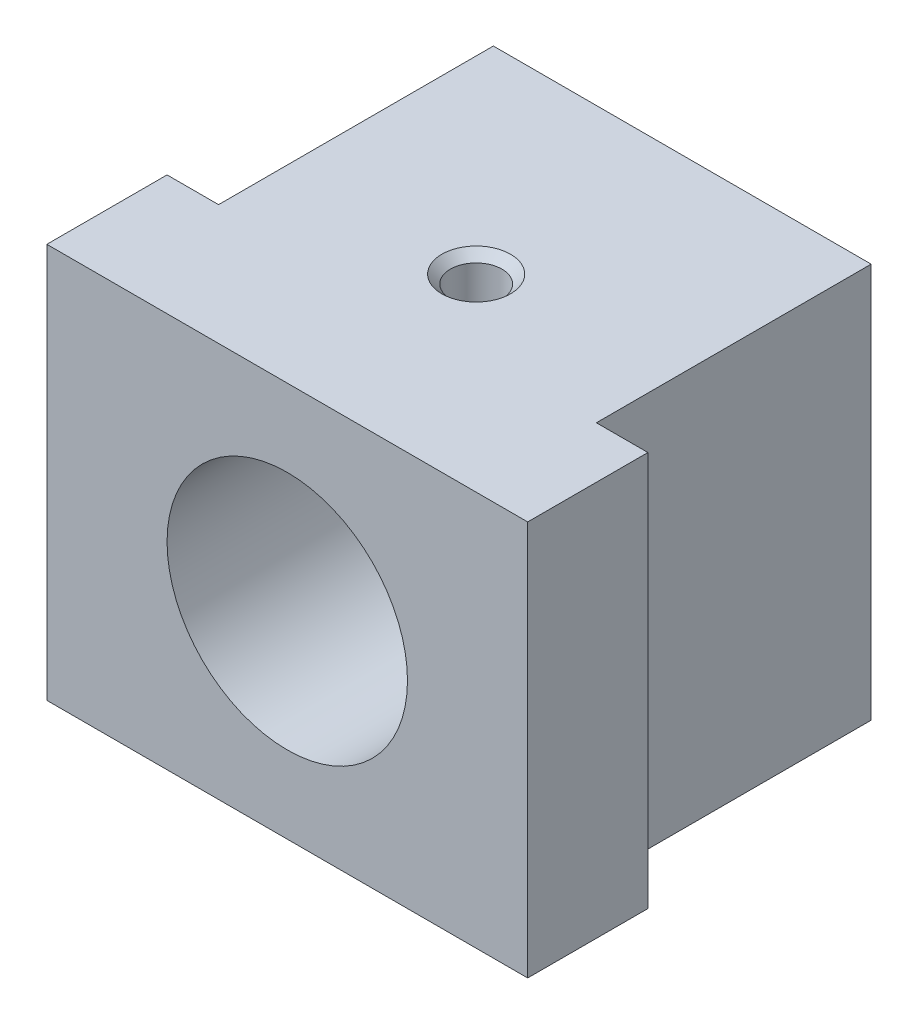
ISO-10303-21;
HEADER;
FILE_DESCRIPTION(('STEP AP214'),'2;1');
FILE_NAME('part.step','',(''),(''),'','','');
FILE_SCHEMA(('AUTOMOTIVE_DESIGN { 1 0 10303 214 1 1 1 1 }'));
ENDSEC;
DATA;
#1=APPLICATION_CONTEXT('core data for automotive mechanical design processes');
#2=APPLICATION_PROTOCOL_DEFINITION('international standard','automotive_design',2000,#1);
#3=PRODUCT_CONTEXT('',#1,'mechanical');
#4=PRODUCT('Part','Part','',(#3));
#5=PRODUCT_RELATED_PRODUCT_CATEGORY('part','',(#4));
#6=PRODUCT_DEFINITION_FORMATION('','',#4);
#7=PRODUCT_DEFINITION_CONTEXT('part definition',#1,'design');
#8=PRODUCT_DEFINITION('design','',#6,#7);
#9=PRODUCT_DEFINITION_SHAPE('','',#8);
#10=(LENGTH_UNIT() NAMED_UNIT(*) SI_UNIT(.MILLI.,.METRE.));
#11=(NAMED_UNIT(*) PLANE_ANGLE_UNIT() SI_UNIT($,.RADIAN.));
#12=(NAMED_UNIT(*) SI_UNIT($,.STERADIAN.) SOLID_ANGLE_UNIT());
#13=UNCERTAINTY_MEASURE_WITH_UNIT(LENGTH_MEASURE(1.E-05),#10,'distance_accuracy_value','');
#14=(GEOMETRIC_REPRESENTATION_CONTEXT(3) GLOBAL_UNCERTAINTY_ASSIGNED_CONTEXT((#13)) GLOBAL_UNIT_ASSIGNED_CONTEXT((#10,
#11,#12)) REPRESENTATION_CONTEXT('',''));
#15=CARTESIAN_POINT('',(0.,0.,0.));
#16=DIRECTION('',(0.,0.,1.));
#17=DIRECTION('',(1.,0.,0.));
#18=AXIS2_PLACEMENT_3D('',#15,#16,#17);
#19=CARTESIAN_POINT('',(0.,23.,-7.));
#20=DIRECTION('',(1.,0.,0.));
#21=DIRECTION('',(0.,0.,-1.));
#22=AXIS2_PLACEMENT_3D('',#19,#20,#21);
#23=PLANE('',#22);
#24=DIRECTION('',(0.,0.,1.));
#25=VECTOR('',#24,1.);
#26=CARTESIAN_POINT('',(0.,0.,-7.));
#27=LINE('',#26,#25);
#28=CARTESIAN_POINT('',(0.,0.,-7.));
#29=VERTEX_POINT('',#28);
#30=CARTESIAN_POINT('',(0.,0.,0.));
#31=VERTEX_POINT('',#30);
#32=EDGE_CURVE('E137',#29,#31,#27,.T.);
#33=ORIENTED_EDGE('',*,*,#32,.T.);
#34=DIRECTION('',(0.,-1.,0.));
#35=VECTOR('',#34,1.);
#36=CARTESIAN_POINT('',(0.,23.,0.));
#37=LINE('',#36,#35);
#38=CARTESIAN_POINT('',(0.,23.,0.));
#39=VERTEX_POINT('',#38);
#40=EDGE_CURVE('E165',#39,#31,#37,.T.);
#41=ORIENTED_EDGE('',*,*,#40,.F.);
#42=DIRECTION('',(0.,0.,1.));
#43=VECTOR('',#42,1.);
#44=CARTESIAN_POINT('',(0.,23.,-7.));
#45=LINE('',#44,#43);
#46=CARTESIAN_POINT('',(0.,23.,-7.));
#47=VERTEX_POINT('',#46);
#48=EDGE_CURVE('E152',#47,#39,#45,.T.);
#49=ORIENTED_EDGE('',*,*,#48,.F.);
#50=DIRECTION('',(0.,-1.,0.));
#51=VECTOR('',#50,1.);
#52=CARTESIAN_POINT('',(0.,23.,-7.));
#53=LINE('',#52,#51);
#54=EDGE_CURVE('E133',#47,#29,#53,.T.);
#55=ORIENTED_EDGE('',*,*,#54,.T.);
#56=EDGE_LOOP('',(#33,#41,#49,#55));
#57=FACE_BOUND('',#56,.T.);
#58=ADVANCED_FACE('F38',(#57),#23,.F.);
#59=CARTESIAN_POINT('',(0.,23.,0.));
#60=DIRECTION('',(0.,0.,-1.));
#61=DIRECTION('',(-1.,0.,0.));
#62=AXIS2_PLACEMENT_3D('',#59,#60,#61);
#63=PLANE('',#62);
#64=CARTESIAN_POINT('',(14.,11.5,0.));
#65=DIRECTION('',(0.,0.,1.));
#66=DIRECTION('',(1.,0.,0.));
#67=AXIS2_PLACEMENT_3D('',#64,#65,#66);
#68=CIRCLE('',#67,7.);
#69=CARTESIAN_POINT('',(21.,11.5,0.));
#70=VERTEX_POINT('',#69);
#71=EDGE_CURVE('E174',#70,#70,#68,.T.);
#72=ORIENTED_EDGE('',*,*,#71,.F.);
#73=EDGE_LOOP('',(#72));
#74=FACE_BOUND('',#73,.T.);
#75=DIRECTION('',(1.,0.,0.));
#76=VECTOR('',#75,1.);
#77=CARTESIAN_POINT('',(0.,0.,0.));
#78=LINE('',#77,#76);
#79=CARTESIAN_POINT('',(28.,0.,0.));
#80=VERTEX_POINT('',#79);
#81=EDGE_CURVE('E140',#31,#80,#78,.T.);
#82=ORIENTED_EDGE('',*,*,#81,.T.);
#83=DIRECTION('',(0.,-1.,0.));
#84=VECTOR('',#83,1.);
#85=CARTESIAN_POINT('',(28.,23.,0.));
#86=LINE('',#85,#84);
#87=CARTESIAN_POINT('',(28.,23.,0.));
#88=VERTEX_POINT('',#87);
#89=EDGE_CURVE('E162',#88,#80,#86,.T.);
#90=ORIENTED_EDGE('',*,*,#89,.F.);
#91=DIRECTION('',(1.,0.,0.));
#92=VECTOR('',#91,1.);
#93=CARTESIAN_POINT('',(0.,23.,0.));
#94=LINE('',#93,#92);
#95=EDGE_CURVE('E100',#39,#88,#94,.T.);
#96=ORIENTED_EDGE('',*,*,#95,.F.);
#97=ORIENTED_EDGE('',*,*,#40,.T.);
#98=EDGE_LOOP('',(#82,#90,#96,#97));
#99=FACE_BOUND('',#98,.T.);
#100=ADVANCED_FACE('F192',(#74,#99),#63,.F.);
#101=CARTESIAN_POINT('',(28.,23.,0.));
#102=DIRECTION('',(-1.,0.,0.));
#103=DIRECTION('',(0.,0.,1.));
#104=AXIS2_PLACEMENT_3D('',#101,#102,#103);
#105=PLANE('',#104);
#106=DIRECTION('',(0.,0.,-1.));
#107=VECTOR('',#106,1.);
#108=CARTESIAN_POINT('',(28.,0.,0.));
#109=LINE('',#108,#107);
#110=CARTESIAN_POINT('',(28.,0.,-7.));
#111=VERTEX_POINT('',#110);
#112=EDGE_CURVE('E143',#80,#111,#109,.T.);
#113=ORIENTED_EDGE('',*,*,#112,.T.);
#114=DIRECTION('',(0.,-1.,0.));
#115=VECTOR('',#114,1.);
#116=CARTESIAN_POINT('',(28.,23.,-7.));
#117=LINE('',#116,#115);
#118=CARTESIAN_POINT('',(28.,23.,-7.));
#119=VERTEX_POINT('',#118);
#120=EDGE_CURVE('E159',#119,#111,#117,.T.);
#121=ORIENTED_EDGE('',*,*,#120,.F.);
#122=DIRECTION('',(0.,0.,-1.));
#123=VECTOR('',#122,1.);
#124=CARTESIAN_POINT('',(28.,23.,0.));
#125=LINE('',#124,#123);
#126=EDGE_CURVE('E306',#88,#119,#125,.T.);
#127=ORIENTED_EDGE('',*,*,#126,.F.);
#128=ORIENTED_EDGE('',*,*,#89,.T.);
#129=EDGE_LOOP('',(#113,#121,#127,#128));
#130=FACE_BOUND('',#129,.T.);
#131=ADVANCED_FACE('F197',(#130),#105,.F.);
#132=CARTESIAN_POINT('',(28.,23.,-7.));
#133=DIRECTION('',(0.,0.,1.));
#134=DIRECTION('',(1.,0.,0.));
#135=AXIS2_PLACEMENT_3D('',#132,#133,#134);
#136=PLANE('',#135);
#137=DIRECTION('',(-1.,0.,0.));
#138=VECTOR('',#137,1.);
#139=CARTESIAN_POINT('',(28.,0.,-7.));
#140=LINE('',#139,#138);
#141=CARTESIAN_POINT('',(25.,0.,-7.));
#142=VERTEX_POINT('',#141);
#143=EDGE_CURVE('E145',#111,#142,#140,.T.);
#144=ORIENTED_EDGE('',*,*,#143,.T.);
#145=DIRECTION('',(0.,-1.,0.));
#146=VECTOR('',#145,1.);
#147=CARTESIAN_POINT('',(25.,23.,-7.));
#148=LINE('',#147,#146);
#149=CARTESIAN_POINT('',(25.,23.,-7.));
#150=VERTEX_POINT('',#149);
#151=EDGE_CURVE('E156',#150,#142,#148,.T.);
#152=ORIENTED_EDGE('',*,*,#151,.F.);
#153=DIRECTION('',(-1.,0.,0.));
#154=VECTOR('',#153,1.);
#155=CARTESIAN_POINT('',(28.,23.,-7.));
#156=LINE('',#155,#154);
#157=EDGE_CURVE('E312',#119,#150,#156,.T.);
#158=ORIENTED_EDGE('',*,*,#157,.F.);
#159=ORIENTED_EDGE('',*,*,#120,.T.);
#160=EDGE_LOOP('',(#144,#152,#158,#159));
#161=FACE_BOUND('',#160,.T.);
#162=ADVANCED_FACE('F203',(#161),#136,.F.);
#163=CARTESIAN_POINT('',(25.,23.,-7.));
#164=DIRECTION('',(-1.,0.,0.));
#165=DIRECTION('',(0.,0.,1.));
#166=AXIS2_PLACEMENT_3D('',#163,#164,#165);
#167=PLANE('',#166);
#168=DIRECTION('',(0.,0.,-1.));
#169=VECTOR('',#168,1.);
#170=CARTESIAN_POINT('',(25.,0.,-7.));
#171=LINE('',#170,#169);
#172=CARTESIAN_POINT('',(25.,0.,-23.));
#173=VERTEX_POINT('',#172);
#174=EDGE_CURVE('E147',#142,#173,#171,.T.);
#175=ORIENTED_EDGE('',*,*,#174,.T.);
#176=DIRECTION('',(0.,-1.,0.));
#177=VECTOR('',#176,1.);
#178=CARTESIAN_POINT('',(25.,23.,-23.));
#179=LINE('',#178,#177);
#180=CARTESIAN_POINT('',(25.,23.,-23.));
#181=VERTEX_POINT('',#180);
#182=EDGE_CURVE('E128',#181,#173,#179,.T.);
#183=ORIENTED_EDGE('',*,*,#182,.F.);
#184=DIRECTION('',(0.,0.,-1.));
#185=VECTOR('',#184,1.);
#186=CARTESIAN_POINT('',(25.,23.,-7.));
#187=LINE('',#186,#185);
#188=EDGE_CURVE('E119',#150,#181,#187,.T.);
#189=ORIENTED_EDGE('',*,*,#188,.F.);
#190=ORIENTED_EDGE('',*,*,#151,.T.);
#191=EDGE_LOOP('',(#175,#183,#189,#190));
#192=FACE_BOUND('',#191,.T.);
#193=ADVANCED_FACE('F207',(#192),#167,.F.);
#194=CARTESIAN_POINT('',(25.,23.,-23.));
#195=DIRECTION('',(0.,0.,1.));
#196=DIRECTION('',(1.,0.,0.));
#197=AXIS2_PLACEMENT_3D('',#194,#195,#196);
#198=PLANE('',#197);
#199=CARTESIAN_POINT('',(14.,11.5,-23.));
#200=DIRECTION('',(0.,0.,1.));
#201=DIRECTION('',(1.,0.,0.));
#202=AXIS2_PLACEMENT_3D('',#199,#200,#201);
#203=CIRCLE('',#202,7.);
#204=CARTESIAN_POINT('',(21.,11.5,-23.));
#205=VERTEX_POINT('',#204);
#206=EDGE_CURVE('E141',#205,#205,#203,.T.);
#207=ORIENTED_EDGE('',*,*,#206,.T.);
#208=EDGE_LOOP('',(#207));
#209=FACE_BOUND('',#208,.T.);
#210=DIRECTION('',(-1.,0.,0.));
#211=VECTOR('',#210,1.);
#212=CARTESIAN_POINT('',(25.,0.,-23.));
#213=LINE('',#212,#211);
#214=CARTESIAN_POINT('',(3.,0.,-23.));
#215=VERTEX_POINT('',#214);
#216=EDGE_CURVE('E127',#173,#215,#213,.T.);
#217=ORIENTED_EDGE('',*,*,#216,.T.);
#218=DIRECTION('',(0.,-1.,0.));
#219=VECTOR('',#218,1.);
#220=CARTESIAN_POINT('',(3.,23.,-23.));
#221=LINE('',#220,#219);
#222=CARTESIAN_POINT('',(3.,23.,-23.));
#223=VERTEX_POINT('',#222);
#224=EDGE_CURVE('E124',#223,#215,#221,.T.);
#225=ORIENTED_EDGE('',*,*,#224,.F.);
#226=DIRECTION('',(-1.,0.,0.));
#227=VECTOR('',#226,1.);
#228=CARTESIAN_POINT('',(25.,23.,-23.));
#229=LINE('',#228,#227);
#230=EDGE_CURVE('E113',#181,#223,#229,.T.);
#231=ORIENTED_EDGE('',*,*,#230,.F.);
#232=ORIENTED_EDGE('',*,*,#182,.T.);
#233=EDGE_LOOP('',(#217,#225,#231,#232));
#234=FACE_BOUND('',#233,.T.);
#235=ADVANCED_FACE('F125',(#209,#234),#198,.F.);
#236=CARTESIAN_POINT('',(3.,23.,-23.));
#237=DIRECTION('',(1.,0.,0.));
#238=DIRECTION('',(0.,0.,-1.));
#239=AXIS2_PLACEMENT_3D('',#236,#237,#238);
#240=PLANE('',#239);
#241=DIRECTION('',(0.,0.,1.));
#242=VECTOR('',#241,1.);
#243=CARTESIAN_POINT('',(3.,0.,-23.));
#244=LINE('',#243,#242);
#245=CARTESIAN_POINT('',(3.,0.,-7.));
#246=VERTEX_POINT('',#245);
#247=EDGE_CURVE('E85',#215,#246,#244,.T.);
#248=ORIENTED_EDGE('',*,*,#247,.T.);
#249=DIRECTION('',(0.,-1.,0.));
#250=VECTOR('',#249,1.);
#251=CARTESIAN_POINT('',(3.,23.,-7.));
#252=LINE('',#251,#250);
#253=CARTESIAN_POINT('',(3.,23.,-7.));
#254=VERTEX_POINT('',#253);
#255=EDGE_CURVE('E129',#254,#246,#252,.T.);
#256=ORIENTED_EDGE('',*,*,#255,.F.);
#257=DIRECTION('',(0.,0.,1.));
#258=VECTOR('',#257,1.);
#259=CARTESIAN_POINT('',(3.,23.,-23.));
#260=LINE('',#259,#258);
#261=EDGE_CURVE('E117',#223,#254,#260,.T.);
#262=ORIENTED_EDGE('',*,*,#261,.F.);
#263=ORIENTED_EDGE('',*,*,#224,.T.);
#264=EDGE_LOOP('',(#248,#256,#262,#263));
#265=FACE_BOUND('',#264,.T.);
#266=ADVANCED_FACE('F131',(#265),#240,.F.);
#267=CARTESIAN_POINT('',(3.,23.,-7.));
#268=DIRECTION('',(0.,0.,1.));
#269=DIRECTION('',(1.,0.,0.));
#270=AXIS2_PLACEMENT_3D('',#267,#268,#269);
#271=PLANE('',#270);
#272=DIRECTION('',(-1.,0.,0.));
#273=VECTOR('',#272,1.);
#274=CARTESIAN_POINT('',(3.,0.,-7.));
#275=LINE('',#274,#273);
#276=EDGE_CURVE('E91',#246,#29,#275,.T.);
#277=ORIENTED_EDGE('',*,*,#276,.T.);
#278=ORIENTED_EDGE('',*,*,#54,.F.);
#279=DIRECTION('',(-1.,0.,0.));
#280=VECTOR('',#279,1.);
#281=CARTESIAN_POINT('',(3.,23.,-7.));
#282=LINE('',#281,#280);
#283=EDGE_CURVE('E56',#254,#47,#282,.T.);
#284=ORIENTED_EDGE('',*,*,#283,.F.);
#285=ORIENTED_EDGE('',*,*,#255,.T.);
#286=EDGE_LOOP('',(#277,#278,#284,#285));
#287=FACE_BOUND('',#286,.T.);
#288=ADVANCED_FACE('F217',(#287),#271,.F.);
#289=CARTESIAN_POINT('',(0.,23.,0.));
#290=DIRECTION('',(0.,1.,0.));
#291=DIRECTION('',(0.,0.,1.));
#292=AXIS2_PLACEMENT_3D('',#289,#290,#291);
#293=PLANE('',#292);
#294=CARTESIAN_POINT('',(14.,23.,-11.));
#295=DIRECTION('',(0.,1.,0.));
#296=DIRECTION('',(0.,0.,1.));
#297=AXIS2_PLACEMENT_3D('',#294,#295,#296);
#298=CIRCLE('',#297,2.);
#299=CARTESIAN_POINT('',(14.,23.,-9.));
#300=VERTEX_POINT('',#299);
#301=EDGE_CURVE('E11',#300,#300,#298,.F.);
#302=ORIENTED_EDGE('',*,*,#301,.T.);
#303=EDGE_LOOP('',(#302));
#304=FACE_BOUND('',#303,.T.);
#305=ORIENTED_EDGE('',*,*,#48,.T.);
#306=ORIENTED_EDGE('',*,*,#95,.T.);
#307=ORIENTED_EDGE('',*,*,#126,.T.);
#308=ORIENTED_EDGE('',*,*,#157,.T.);
#309=ORIENTED_EDGE('',*,*,#188,.T.);
#310=ORIENTED_EDGE('',*,*,#230,.T.);
#311=ORIENTED_EDGE('',*,*,#261,.T.);
#312=ORIENTED_EDGE('',*,*,#283,.T.);
#313=EDGE_LOOP('',(#305,#306,#307,#308,#309,#310,#311,#312));
#314=FACE_BOUND('',#313,.T.);
#315=ADVANCED_FACE('F115',(#304,#314),#293,.T.);
#316=CARTESIAN_POINT('',(0.,0.,0.));
#317=DIRECTION('',(0.,1.,0.));
#318=DIRECTION('',(0.,0.,1.));
#319=AXIS2_PLACEMENT_3D('',#316,#317,#318);
#320=PLANE('',#319);
#321=ORIENTED_EDGE('',*,*,#32,.F.);
#322=ORIENTED_EDGE('',*,*,#276,.F.);
#323=ORIENTED_EDGE('',*,*,#247,.F.);
#324=ORIENTED_EDGE('',*,*,#216,.F.);
#325=ORIENTED_EDGE('',*,*,#174,.F.);
#326=ORIENTED_EDGE('',*,*,#143,.F.);
#327=ORIENTED_EDGE('',*,*,#112,.F.);
#328=ORIENTED_EDGE('',*,*,#81,.F.);
#329=EDGE_LOOP('',(#321,#322,#323,#324,#325,#326,#327,#328));
#330=FACE_BOUND('',#329,.T.);
#331=ADVANCED_FACE('F187',(#330),#320,.F.);
#332=CARTESIAN_POINT('',(14.,11.5,-23.));
#333=DIRECTION('',(0.,0.,1.));
#334=DIRECTION('',(1.,0.,0.));
#335=AXIS2_PLACEMENT_3D('',#332,#333,#334);
#336=CYLINDRICAL_SURFACE('',#335,7.);
#337=CARTESIAN_POINT('',(14.,18.5,-9.5));
#338=CARTESIAN_POINT('',(14.0832358860906,18.4999984604323,-9.50000289957431));
#339=CARTESIAN_POINT('',(14.1665071956003,18.4985002594971,-9.50695160838786));
#340=CARTESIAN_POINT('',(14.3306873442933,18.4926682982773,-9.53453565685359));
#341=CARTESIAN_POINT('',(14.4115944035712,18.488332456371,-9.55518104419493));
#342=CARTESIAN_POINT('',(14.5686493238177,18.4773083178883,-9.60948436460804));
#343=CARTESIAN_POINT('',(14.6448019634466,18.4706224296717,-9.64312897938132));
#344=CARTESIAN_POINT('',(14.7903781779608,18.4556210681797,-9.72243408617127));
#345=CARTESIAN_POINT('',(14.8598019817474,18.4473056503666,-9.76809416924994));
#346=CARTESIAN_POINT('',(14.9910247905352,18.4298136924631,-9.87088029967351));
#347=CARTESIAN_POINT('',(15.0527050341944,18.4206268314326,-9.92815622189853));
#348=CARTESIAN_POINT('',(15.1656604238943,18.4025006981414,-10.0522263156852));
#349=CARTESIAN_POINT('',(15.2169346715091,18.3935614473163,-10.1190213082513));
#350=CARTESIAN_POINT('',(15.3081420437981,18.3768411604723,-10.2611057528604));
#351=CARTESIAN_POINT('',(15.3479495833501,18.3690733634436,-10.3364775177562));
#352=CARTESIAN_POINT('',(15.4142882369115,18.3557232555854,-10.4930344537668));
#353=CARTESIAN_POINT('',(15.4408208700172,18.3501406947071,-10.5742189584926));
#354=CARTESIAN_POINT('',(15.4794657442245,18.3418980892631,-10.7388110865881));
#355=CARTESIAN_POINT('',(15.4917877974834,18.3391955689649,-10.8221672756639));
#356=CARTESIAN_POINT('',(15.5023139520658,18.3368913984511,-10.989804232507));
#357=CARTESIAN_POINT('',(15.5005197166463,18.3372893829173,-11.0740848901799));
#358=CARTESIAN_POINT('',(15.4830332634086,18.3411027660383,-11.2396246879338));
#359=CARTESIAN_POINT('',(15.4675839864941,18.3444654168216,-11.3209108891002));
#360=CARTESIAN_POINT('',(15.4236105429868,18.3537459337579,-11.4797102402893));
#361=CARTESIAN_POINT('',(15.3950856693647,18.359663938084,-11.5572231860323));
#362=CARTESIAN_POINT('',(15.3255455107599,18.3734408075572,-11.7069628728733));
#363=CARTESIAN_POINT('',(15.2844361097283,18.3813142098337,-11.7791445127126));
#364=CARTESIAN_POINT('',(15.1909600728399,18.3981057250129,-11.915675164958));
#365=CARTESIAN_POINT('',(15.1385919610356,18.407023974819,-11.9800231486862));
#366=CARTESIAN_POINT('',(15.0227954275532,18.4251271839388,-12.1004593556734));
#367=CARTESIAN_POINT('',(14.9591602339644,18.4343138397218,-12.1563487065847));
#368=CARTESIAN_POINT('',(14.8233173062691,18.4517501749706,-12.2566937336897));
#369=CARTESIAN_POINT('',(14.7511094287754,18.4599998387597,-12.3011492186004));
#370=CARTESIAN_POINT('',(14.59993346205,18.47465778534,-12.3774106799069));
#371=CARTESIAN_POINT('',(14.5209522588635,18.4810623864335,-12.409191412578));
#372=CARTESIAN_POINT('',(14.3586031466857,18.4912810924533,-12.4589756483211));
#373=CARTESIAN_POINT('',(14.2752358511337,18.4950955586038,-12.4769810725633));
#374=CARTESIAN_POINT('',(14.1081876708366,18.4996530634781,-12.4984162141434));
#375=CARTESIAN_POINT('',(14.0245431772716,18.5004533652107,-12.5021177128818));
#376=CARTESIAN_POINT('',(13.8578310263496,18.4990524893597,-12.4955754288748));
#377=CARTESIAN_POINT('',(13.7747633318727,18.496851506757,-12.4853325520371));
#378=CARTESIAN_POINT('',(13.6124574620172,18.4897314304527,-12.4514177563383));
#379=CARTESIAN_POINT('',(13.5331882870915,18.4848410504546,-12.4278876305275));
#380=CARTESIAN_POINT('',(13.3797215495266,18.4728892442151,-12.3682230570052));
#381=CARTESIAN_POINT('',(13.3055244074123,18.4658276382224,-12.3320875656883));
#382=CARTESIAN_POINT('',(13.1631786020352,18.450175043904,-12.2476664569397));
#383=CARTESIAN_POINT('',(13.0951274248889,18.4415643135428,-12.1992202050903));
#384=CARTESIAN_POINT('',(12.9680230744764,18.4238103303485,-12.0917651751113));
#385=CARTESIAN_POINT('',(12.908971021308,18.414667011421,-12.0327550841126));
#386=CARTESIAN_POINT('',(12.8004728894201,18.3966817270632,-11.9046026298129));
#387=CARTESIAN_POINT('',(12.7512146274484,18.3878479222128,-11.8352999007779));
#388=CARTESIAN_POINT('',(12.6650358461396,18.3716665455968,-11.689245403522));
#389=CARTESIAN_POINT('',(12.6281148008629,18.3643189104806,-11.6124939530225));
#390=CARTESIAN_POINT('',(12.5679025875145,18.3520100980739,-11.4541277010054));
#391=CARTESIAN_POINT('',(12.5445360135873,18.3470357458297,-11.3725426435693));
#392=CARTESIAN_POINT('',(12.5118730391466,18.3400118670842,-11.2064844161664));
#393=CARTESIAN_POINT('',(12.5025744921974,18.3379618943971,-11.1220116887987));
#394=CARTESIAN_POINT('',(12.4984000007396,18.3370461884816,-10.9544676568248));
#395=CARTESIAN_POINT('',(12.5032265274169,18.3381147651854,-10.8714039850194));
#396=CARTESIAN_POINT('',(12.5265021059367,18.3431676318483,-10.7073027578674));
#397=CARTESIAN_POINT('',(12.5449510104202,18.3471518902671,-10.6262651806134));
#398=CARTESIAN_POINT('',(12.5948065405957,18.3575558110416,-10.4687413421308));
#399=CARTESIAN_POINT('',(12.6261715282911,18.363967642247,-10.3922413513357));
#400=CARTESIAN_POINT('',(12.700932484044,18.3785076459065,-10.2455446274931));
#401=CARTESIAN_POINT('',(12.744329646985,18.3866359888036,-10.175348521385));
#402=CARTESIAN_POINT('',(12.842917096507,18.4038905559323,-10.0417818062746));
#403=CARTESIAN_POINT('',(12.8983201257876,18.4130330993893,-9.97857030405303));
#404=CARTESIAN_POINT('',(13.0189134453804,18.4311744979969,-9.86224373747954));
#405=CARTESIAN_POINT('',(13.0841059906144,18.440173319513,-9.8091310056878));
#406=CARTESIAN_POINT('',(13.2233968527313,18.4571449104899,-9.71388404049444));
#407=CARTESIAN_POINT('',(13.2975951539904,18.4651036457063,-9.67189339376902));
#408=CARTESIAN_POINT('',(13.4521498390594,18.4789582610402,-9.60104547109382));
#409=CARTESIAN_POINT('',(13.5325008941361,18.4848559021234,-9.57217697741497));
#410=CARTESIAN_POINT('',(13.6774647824468,18.4928484846177,-9.53364781486885));
#411=CARTESIAN_POINT('',(13.741282794454,18.4955139188826,-9.52105356601997));
#412=CARTESIAN_POINT('',(13.8700600391462,18.4990902415472,-9.50422869828833));
#413=CARTESIAN_POINT('',(13.9350192249113,18.5000012019131,-9.49999773635394));
#414=CARTESIAN_POINT('',(14.,18.5,-9.5));
#415=B_SPLINE_CURVE_WITH_KNOTS('',3,(#337,#338,#339,#340,#341,#342,#343,#344,#345,#346,#347,
#348,#349,#350,#351,#352,#353,#354,#355,#356,#357,#358,#359,#360,#361,#362,#363,#364,#365,#366,
#367,#368,#369,#370,#371,#372,#373,#374,#375,#376,#377,#378,#379,#380,#381,#382,#383,#384,#385,
#386,#387,#388,#389,#390,#391,#392,#393,#394,#395,#396,#397,#398,#399,#400,#401,#402,#403,#404,
#405,#406,#407,#408,#409,#410,#411,#412,#413,#414),.UNSPECIFIED.,.T.,.F.,(4,2,2,2,2,2,2,2,2,2,2,
2,2,2,2,2,2,2,2,2,2,2,2,2,2,2,2,2,2,2,2,2,2,2,2,2,2,2,4),(0.,0.249469836512082,
0.499122883219935,0.748520824425603,0.997910278645885,1.25074961881732,1.50361077918506,
1.7591442921451,2.01464855677489,2.26633008124666,2.51798195169165,2.76524475452927,
3.01252092904568,3.26169356165967,3.51089887920889,3.7652701105029,4.0196455970235,
4.27452521139806,4.52936927256343,4.77934665704184,5.02930780231429,5.27665060589267,
5.52401389198433,5.77478733867802,6.02559197304484,6.28082063283533,6.53603841075805,
6.78982240408474,7.04356767229184,7.29200680540293,7.54044325108269,7.78808499706784,
8.03575134451622,8.28822950154113,8.54076590397114,8.79641910357221,9.0518533401027,
9.24661799132293,9.44137465337335),.UNSPECIFIED.);
#416=CARTESIAN_POINT('',(14.,18.5,-9.5));
#417=VERTEX_POINT('',#416);
#418=EDGE_CURVE('E167',#417,#417,#415,.T.);
#419=ORIENTED_EDGE('',*,*,#418,.T.);
#420=EDGE_LOOP('',(#419));
#421=FACE_BOUND('',#420,.T.);
#422=ORIENTED_EDGE('',*,*,#206,.F.);
#423=EDGE_LOOP('',(#422));
#424=FACE_BOUND('',#423,.T.);
#425=ORIENTED_EDGE('',*,*,#71,.T.);
#426=EDGE_LOOP('',(#425));
#427=FACE_BOUND('',#426,.T.);
#428=ADVANCED_FACE('F175',(#421,#424,#427),#336,.F.);
#429=CARTESIAN_POINT('',(14.,13.,-11.));
#430=DIRECTION('',(0.,1.,0.));
#431=DIRECTION('',(0.,0.,1.));
#432=AXIS2_PLACEMENT_3D('',#429,#430,#431);
#433=CYLINDRICAL_SURFACE('',#432,1.5);
#434=CARTESIAN_POINT('',(14.,22.5,-11.));
#435=DIRECTION('',(0.,1.,0.));
#436=DIRECTION('',(0.,0.,1.));
#437=AXIS2_PLACEMENT_3D('',#434,#435,#436);
#438=CIRCLE('',#437,1.5);
#439=CARTESIAN_POINT('',(14.,22.5,-9.5));
#440=VERTEX_POINT('',#439);
#441=EDGE_CURVE('E48',#440,#440,#438,.T.);
#442=ORIENTED_EDGE('',*,*,#441,.T.);
#443=EDGE_LOOP('',(#442));
#444=FACE_BOUND('',#443,.T.);
#445=ORIENTED_EDGE('',*,*,#418,.F.);
#446=EDGE_LOOP('',(#445));
#447=FACE_BOUND('',#446,.T.);
#448=ADVANCED_FACE('F178',(#444,#447),#433,.F.);
#449=CARTESIAN_POINT('',(14.,22.5,-11.));
#450=DIRECTION('',(0.,1.,0.));
#451=DIRECTION('',(0.,0.,1.));
#452=AXIS2_PLACEMENT_3D('',#449,#450,#451);
#453=CONICAL_SURFACE('',#452,1.5,0.785398163397451);
#454=ORIENTED_EDGE('',*,*,#301,.F.);
#455=EDGE_LOOP('',(#454));
#456=FACE_BOUND('',#455,.T.);
#457=ORIENTED_EDGE('',*,*,#441,.F.);
#458=EDGE_LOOP('',(#457));
#459=FACE_BOUND('',#458,.T.);
#460=ADVANCED_FACE('F41',(#456,#459),#453,.F.);
#461=CLOSED_SHELL('',(#58,#100,#131,#162,#193,#235,#266,#288,#315,#331,#428,#448,#460));
#462=MANIFOLD_SOLID_BREP('B2',#461);
#463=ADVANCED_BREP_SHAPE_REPRESENTATION('',(#18,#462),#14);
#464=SHAPE_DEFINITION_REPRESENTATION(#9,#463);
ENDSEC;
END-ISO-10303-21;
